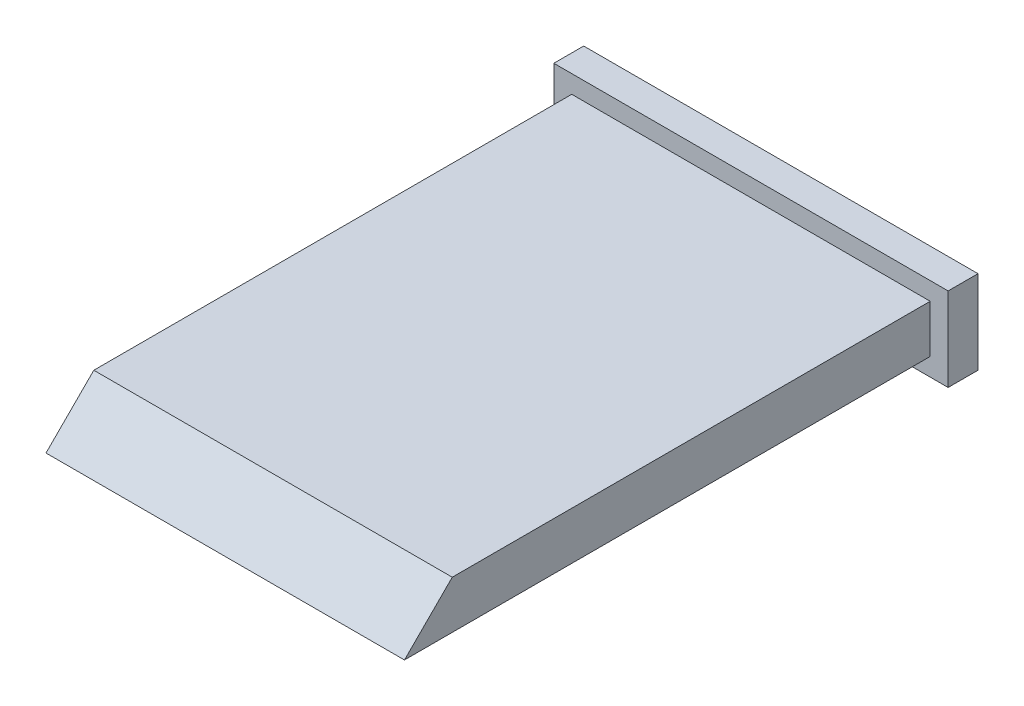
ISO-10303-21;
HEADER;
FILE_DESCRIPTION(('STEP AP214'),'2;1');
FILE_NAME('part.step','',(''),(''),'','','');
FILE_SCHEMA(('AUTOMOTIVE_DESIGN { 1 0 10303 214 1 1 1 1 }'));
ENDSEC;
DATA;
#1=APPLICATION_CONTEXT('core data for automotive mechanical design processes');
#2=APPLICATION_PROTOCOL_DEFINITION('international standard','automotive_design',2000,#1);
#3=PRODUCT_CONTEXT('',#1,'mechanical');
#4=PRODUCT('Part','Part','',(#3));
#5=PRODUCT_RELATED_PRODUCT_CATEGORY('part','',(#4));
#6=PRODUCT_DEFINITION_FORMATION('','',#4);
#7=PRODUCT_DEFINITION_CONTEXT('part definition',#1,'design');
#8=PRODUCT_DEFINITION('design','',#6,#7);
#9=PRODUCT_DEFINITION_SHAPE('','',#8);
#10=(LENGTH_UNIT() NAMED_UNIT(*) SI_UNIT(.MILLI.,.METRE.));
#11=(NAMED_UNIT(*) PLANE_ANGLE_UNIT() SI_UNIT($,.RADIAN.));
#12=(NAMED_UNIT(*) SI_UNIT($,.STERADIAN.) SOLID_ANGLE_UNIT());
#13=UNCERTAINTY_MEASURE_WITH_UNIT(LENGTH_MEASURE(1.E-05),#10,'distance_accuracy_value','');
#14=(GEOMETRIC_REPRESENTATION_CONTEXT(3) GLOBAL_UNCERTAINTY_ASSIGNED_CONTEXT((#13)) GLOBAL_UNIT_ASSIGNED_CONTEXT((#10,
#11,#12)) REPRESENTATION_CONTEXT('',''));
#15=CARTESIAN_POINT('',(0.,0.,0.));
#16=DIRECTION('',(0.,0.,1.));
#17=DIRECTION('',(1.,0.,0.));
#18=AXIS2_PLACEMENT_3D('',#15,#16,#17);
#19=CARTESIAN_POINT('',(60.,0.,-88.0000000000001));
#20=DIRECTION('',(0.,1.,0.));
#21=DIRECTION('',(0.,0.,1.));
#22=AXIS2_PLACEMENT_3D('',#19,#20,#21);
#23=PLANE('',#22);
#24=DIRECTION('',(0.,0.,-1.));
#25=VECTOR('',#24,1.);
#26=CARTESIAN_POINT('',(0.,0.,-88.0000000000001));
#27=LINE('',#26,#25);
#28=CARTESIAN_POINT('',(0.,0.,0.));
#29=VERTEX_POINT('',#28);
#30=CARTESIAN_POINT('',(0.,0.,-88.0000000000001));
#31=VERTEX_POINT('',#30);
#32=EDGE_CURVE('E130',#29,#31,#27,.T.);
#33=ORIENTED_EDGE('',*,*,#32,.T.);
#34=DIRECTION('',(-1.,0.,0.));
#35=VECTOR('',#34,1.);
#36=CARTESIAN_POINT('',(60.,0.,-88.0000000000001));
#37=LINE('',#36,#35);
#38=CARTESIAN_POINT('',(60.,0.,-88.0000000000001));
#39=VERTEX_POINT('',#38);
#40=EDGE_CURVE('E11',#39,#31,#37,.T.);
#41=ORIENTED_EDGE('',*,*,#40,.F.);
#42=DIRECTION('',(0.,0.,-1.));
#43=VECTOR('',#42,1.);
#44=CARTESIAN_POINT('',(60.,0.,-88.0000000000001));
#45=LINE('',#44,#43);
#46=CARTESIAN_POINT('',(60.,0.,0.));
#47=VERTEX_POINT('',#46);
#48=EDGE_CURVE('E75',#47,#39,#45,.T.);
#49=ORIENTED_EDGE('',*,*,#48,.F.);
#50=DIRECTION('',(-1.,0.,0.));
#51=VECTOR('',#50,1.);
#52=CARTESIAN_POINT('',(60.,0.,0.));
#53=LINE('',#52,#51);
#54=EDGE_CURVE('E144',#47,#29,#53,.T.);
#55=ORIENTED_EDGE('',*,*,#54,.T.);
#56=EDGE_LOOP('',(#33,#41,#49,#55));
#57=FACE_BOUND('',#56,.T.);
#58=ADVANCED_FACE('F33',(#57),#23,.F.);
#59=CARTESIAN_POINT('',(60.,7.99999999999999,-8.00000000000007));
#60=DIRECTION('',(0.,-1.,0.));
#61=DIRECTION('',(0.,0.,-1.));
#62=AXIS2_PLACEMENT_3D('',#59,#60,#61);
#63=PLANE('',#62);
#64=DIRECTION('',(0.,0.,1.));
#65=VECTOR('',#64,1.);
#66=CARTESIAN_POINT('',(0.,7.99999999999999,-8.00000000000007));
#67=LINE('',#66,#65);
#68=CARTESIAN_POINT('',(0.,7.99999999999999,-88.0000000000001));
#69=VERTEX_POINT('',#68);
#70=CARTESIAN_POINT('',(0.,7.99999999999999,-8.00000000000007));
#71=VERTEX_POINT('',#70);
#72=EDGE_CURVE('E64',#69,#71,#67,.T.);
#73=ORIENTED_EDGE('',*,*,#72,.T.);
#74=DIRECTION('',(-1.,0.,0.));
#75=VECTOR('',#74,1.);
#76=CARTESIAN_POINT('',(60.,7.99999999999999,-8.00000000000007));
#77=LINE('',#76,#75);
#78=CARTESIAN_POINT('',(60.,7.99999999999999,-8.00000000000007));
#79=VERTEX_POINT('',#78);
#80=EDGE_CURVE('E151',#79,#71,#77,.T.);
#81=ORIENTED_EDGE('',*,*,#80,.F.);
#82=DIRECTION('',(0.,0.,1.));
#83=VECTOR('',#82,1.);
#84=CARTESIAN_POINT('',(60.,7.99999999999999,-8.00000000000007));
#85=LINE('',#84,#83);
#86=CARTESIAN_POINT('',(60.,7.99999999999999,-88.0000000000001));
#87=VERTEX_POINT('',#86);
#88=EDGE_CURVE('E142',#87,#79,#85,.T.);
#89=ORIENTED_EDGE('',*,*,#88,.F.);
#90=DIRECTION('',(-1.,0.,0.));
#91=VECTOR('',#90,1.);
#92=CARTESIAN_POINT('',(60.,7.99999999999999,-88.0000000000001));
#93=LINE('',#92,#91);
#94=EDGE_CURVE('E41',#87,#69,#93,.T.);
#95=ORIENTED_EDGE('',*,*,#94,.T.);
#96=EDGE_LOOP('',(#73,#81,#89,#95));
#97=FACE_BOUND('',#96,.T.);
#98=ADVANCED_FACE('F154',(#97),#63,.F.);
#99=CARTESIAN_POINT('',(60.,0.,0.));
#100=DIRECTION('',(0.,-0.707106781186551,-0.707106781186544));
#101=DIRECTION('',(0.,0.707106781186544,-0.707106781186551));
#102=AXIS2_PLACEMENT_3D('',#99,#100,#101);
#103=PLANE('',#102);
#104=DIRECTION('',(0.,-0.707106781186544,0.707106781186551));
#105=VECTOR('',#104,1.);
#106=CARTESIAN_POINT('',(0.,0.,0.));
#107=LINE('',#106,#105);
#108=EDGE_CURVE('E70',#71,#29,#107,.T.);
#109=ORIENTED_EDGE('',*,*,#108,.T.);
#110=ORIENTED_EDGE('',*,*,#54,.F.);
#111=DIRECTION('',(0.,-0.707106781186544,0.707106781186551));
#112=VECTOR('',#111,1.);
#113=CARTESIAN_POINT('',(60.,0.,0.));
#114=LINE('',#113,#112);
#115=EDGE_CURVE('E49',#79,#47,#114,.T.);
#116=ORIENTED_EDGE('',*,*,#115,.F.);
#117=ORIENTED_EDGE('',*,*,#80,.T.);
#118=EDGE_LOOP('',(#109,#110,#116,#117));
#119=FACE_BOUND('',#118,.T.);
#120=ADVANCED_FACE('F163',(#119),#103,.F.);
#121=CARTESIAN_POINT('',(60.,0.,0.));
#122=DIRECTION('',(1.,0.,0.));
#123=DIRECTION('',(0.,0.,-1.));
#124=AXIS2_PLACEMENT_3D('',#121,#122,#123);
#125=PLANE('',#124);
#126=ORIENTED_EDGE('',*,*,#48,.T.);
#127=DIRECTION('',(0.,1.,0.));
#128=VECTOR('',#127,1.);
#129=CARTESIAN_POINT('',(60.,7.99999999999999,-88.0000000000001));
#130=LINE('',#129,#128);
#131=EDGE_CURVE('E140',#39,#87,#130,.T.);
#132=ORIENTED_EDGE('',*,*,#131,.T.);
#133=ORIENTED_EDGE('',*,*,#88,.T.);
#134=ORIENTED_EDGE('',*,*,#115,.T.);
#135=EDGE_LOOP('',(#126,#132,#133,#134));
#136=FACE_BOUND('',#135,.T.);
#137=ADVANCED_FACE('F165',(#136),#125,.T.);
#138=CARTESIAN_POINT('',(0.,0.,0.));
#139=DIRECTION('',(1.,0.,0.));
#140=DIRECTION('',(0.,0.,-1.));
#141=AXIS2_PLACEMENT_3D('',#138,#139,#140);
#142=PLANE('',#141);
#143=ORIENTED_EDGE('',*,*,#32,.F.);
#144=ORIENTED_EDGE('',*,*,#108,.F.);
#145=ORIENTED_EDGE('',*,*,#72,.F.);
#146=DIRECTION('',(0.,1.,0.));
#147=VECTOR('',#146,1.);
#148=CARTESIAN_POINT('',(0.,7.99999999999999,-88.0000000000001));
#149=LINE('',#148,#147);
#150=EDGE_CURVE('E133',#31,#69,#149,.T.);
#151=ORIENTED_EDGE('',*,*,#150,.F.);
#152=EDGE_LOOP('',(#143,#144,#145,#151));
#153=FACE_BOUND('',#152,.T.);
#154=ADVANCED_FACE('F161',(#153),#142,.F.);
#155=CARTESIAN_POINT('',(63.,-2.99999999999999,-93.0000000000001));
#156=DIRECTION('',(0.,1.,0.));
#157=DIRECTION('',(0.,0.,1.));
#158=AXIS2_PLACEMENT_3D('',#155,#156,#157);
#159=PLANE('',#158);
#160=DIRECTION('',(-1.,0.,0.));
#161=VECTOR('',#160,1.);
#162=CARTESIAN_POINT('',(63.,-2.99999999999999,-88.0000000000001));
#163=LINE('',#162,#161);
#164=CARTESIAN_POINT('',(63.,-2.99999999999999,-88.0000000000001));
#165=VERTEX_POINT('',#164);
#166=CARTESIAN_POINT('',(-3.,-2.99999999999999,-88.0000000000001));
#167=VERTEX_POINT('',#166);
#168=EDGE_CURVE('E129',#165,#167,#163,.T.);
#169=ORIENTED_EDGE('',*,*,#168,.T.);
#170=DIRECTION('',(0.,0.,1.));
#171=VECTOR('',#170,1.);
#172=CARTESIAN_POINT('',(-3.,-2.99999999999999,-93.0000000000001));
#173=LINE('',#172,#171);
#174=CARTESIAN_POINT('',(-3.,-2.99999999999999,-93.0000000000001));
#175=VERTEX_POINT('',#174);
#176=EDGE_CURVE('E109',#175,#167,#173,.T.);
#177=ORIENTED_EDGE('',*,*,#176,.F.);
#178=DIRECTION('',(-1.,0.,0.));
#179=VECTOR('',#178,1.);
#180=CARTESIAN_POINT('',(63.,-2.99999999999999,-93.0000000000001));
#181=LINE('',#180,#179);
#182=CARTESIAN_POINT('',(63.,-2.99999999999999,-93.0000000000001));
#183=VERTEX_POINT('',#182);
#184=EDGE_CURVE('E116',#183,#175,#181,.T.);
#185=ORIENTED_EDGE('',*,*,#184,.F.);
#186=DIRECTION('',(0.,0.,1.));
#187=VECTOR('',#186,1.);
#188=CARTESIAN_POINT('',(63.,-2.99999999999999,-93.0000000000001));
#189=LINE('',#188,#187);
#190=EDGE_CURVE('E252',#183,#165,#189,.T.);
#191=ORIENTED_EDGE('',*,*,#190,.T.);
#192=EDGE_LOOP('',(#169,#177,#185,#191));
#193=FACE_BOUND('',#192,.T.);
#194=ADVANCED_FACE('F127',(#193),#159,.F.);
#195=CARTESIAN_POINT('',(-3.,-2.99999999999999,-93.0000000000001));
#196=DIRECTION('',(1.,0.,0.));
#197=DIRECTION('',(0.,0.,-1.));
#198=AXIS2_PLACEMENT_3D('',#195,#196,#197);
#199=PLANE('',#198);
#200=DIRECTION('',(0.,1.,0.));
#201=VECTOR('',#200,1.);
#202=CARTESIAN_POINT('',(-3.,-2.99999999999999,-88.0000000000001));
#203=LINE('',#202,#201);
#204=CARTESIAN_POINT('',(-3.,11.,-88.0000000000001));
#205=VERTEX_POINT('',#204);
#206=EDGE_CURVE('E258',#167,#205,#203,.T.);
#207=ORIENTED_EDGE('',*,*,#206,.T.);
#208=DIRECTION('',(0.,0.,1.));
#209=VECTOR('',#208,1.);
#210=CARTESIAN_POINT('',(-3.,11.,-93.0000000000001));
#211=LINE('',#210,#209);
#212=CARTESIAN_POINT('',(-3.,11.,-93.0000000000001));
#213=VERTEX_POINT('',#212);
#214=EDGE_CURVE('E112',#213,#205,#211,.T.);
#215=ORIENTED_EDGE('',*,*,#214,.F.);
#216=DIRECTION('',(0.,1.,0.));
#217=VECTOR('',#216,1.);
#218=CARTESIAN_POINT('',(-3.,-2.99999999999999,-93.0000000000001));
#219=LINE('',#218,#217);
#220=EDGE_CURVE('E105',#175,#213,#219,.T.);
#221=ORIENTED_EDGE('',*,*,#220,.F.);
#222=ORIENTED_EDGE('',*,*,#176,.T.);
#223=EDGE_LOOP('',(#207,#215,#221,#222));
#224=FACE_BOUND('',#223,.T.);
#225=ADVANCED_FACE('F107',(#224),#199,.F.);
#226=CARTESIAN_POINT('',(-3.,11.,-93.0000000000001));
#227=DIRECTION('',(0.,-1.,0.));
#228=DIRECTION('',(0.,0.,-1.));
#229=AXIS2_PLACEMENT_3D('',#226,#227,#228);
#230=PLANE('',#229);
#231=DIRECTION('',(1.,0.,0.));
#232=VECTOR('',#231,1.);
#233=CARTESIAN_POINT('',(-3.,11.,-88.0000000000001));
#234=LINE('',#233,#232);
#235=CARTESIAN_POINT('',(63.,11.,-88.0000000000001));
#236=VERTEX_POINT('',#235);
#237=EDGE_CURVE('E255',#205,#236,#234,.T.);
#238=ORIENTED_EDGE('',*,*,#237,.T.);
#239=DIRECTION('',(0.,0.,1.));
#240=VECTOR('',#239,1.);
#241=CARTESIAN_POINT('',(63.,11.,-93.0000000000001));
#242=LINE('',#241,#240);
#243=CARTESIAN_POINT('',(63.,11.,-93.0000000000001));
#244=VERTEX_POINT('',#243);
#245=EDGE_CURVE('E135',#244,#236,#242,.T.);
#246=ORIENTED_EDGE('',*,*,#245,.F.);
#247=DIRECTION('',(1.,0.,0.));
#248=VECTOR('',#247,1.);
#249=CARTESIAN_POINT('',(-3.,11.,-93.0000000000001));
#250=LINE('',#249,#248);
#251=EDGE_CURVE('E115',#213,#244,#250,.T.);
#252=ORIENTED_EDGE('',*,*,#251,.F.);
#253=ORIENTED_EDGE('',*,*,#214,.T.);
#254=EDGE_LOOP('',(#238,#246,#252,#253));
#255=FACE_BOUND('',#254,.T.);
#256=ADVANCED_FACE('F211',(#255),#230,.F.);
#257=CARTESIAN_POINT('',(63.,11.,-93.0000000000001));
#258=DIRECTION('',(-1.,0.,0.));
#259=DIRECTION('',(0.,0.,1.));
#260=AXIS2_PLACEMENT_3D('',#257,#258,#259);
#261=PLANE('',#260);
#262=DIRECTION('',(0.,-1.,0.));
#263=VECTOR('',#262,1.);
#264=CARTESIAN_POINT('',(63.,11.,-88.0000000000001));
#265=LINE('',#264,#263);
#266=EDGE_CURVE('E125',#236,#165,#265,.T.);
#267=ORIENTED_EDGE('',*,*,#266,.T.);
#268=ORIENTED_EDGE('',*,*,#190,.F.);
#269=DIRECTION('',(0.,-1.,0.));
#270=VECTOR('',#269,1.);
#271=CARTESIAN_POINT('',(63.,11.,-93.0000000000001));
#272=LINE('',#271,#270);
#273=EDGE_CURVE('E121',#244,#183,#272,.T.);
#274=ORIENTED_EDGE('',*,*,#273,.F.);
#275=ORIENTED_EDGE('',*,*,#245,.T.);
#276=EDGE_LOOP('',(#267,#268,#274,#275));
#277=FACE_BOUND('',#276,.T.);
#278=ADVANCED_FACE('F220',(#277),#261,.F.);
#279=CARTESIAN_POINT('',(0.,0.,-93.0000000000001));
#280=DIRECTION('',(0.,0.,-1.));
#281=DIRECTION('',(-1.,0.,0.));
#282=AXIS2_PLACEMENT_3D('',#279,#280,#281);
#283=PLANE('',#282);
#284=ORIENTED_EDGE('',*,*,#184,.T.);
#285=ORIENTED_EDGE('',*,*,#220,.T.);
#286=ORIENTED_EDGE('',*,*,#251,.T.);
#287=ORIENTED_EDGE('',*,*,#273,.T.);
#288=EDGE_LOOP('',(#284,#285,#286,#287));
#289=FACE_BOUND('',#288,.T.);
#290=ADVANCED_FACE('F119',(#289),#283,.T.);
#291=CARTESIAN_POINT('',(0.,0.,-88.0000000000001));
#292=DIRECTION('',(0.,0.,-1.));
#293=DIRECTION('',(-1.,0.,0.));
#294=AXIS2_PLACEMENT_3D('',#291,#292,#293);
#295=PLANE('',#294);
#296=ORIENTED_EDGE('',*,*,#131,.F.);
#297=ORIENTED_EDGE('',*,*,#40,.T.);
#298=ORIENTED_EDGE('',*,*,#150,.T.);
#299=ORIENTED_EDGE('',*,*,#94,.F.);
#300=EDGE_LOOP('',(#296,#297,#298,#299));
#301=FACE_BOUND('',#300,.T.);
#302=ORIENTED_EDGE('',*,*,#168,.F.);
#303=ORIENTED_EDGE('',*,*,#266,.F.);
#304=ORIENTED_EDGE('',*,*,#237,.F.);
#305=ORIENTED_EDGE('',*,*,#206,.F.);
#306=EDGE_LOOP('',(#302,#303,#304,#305));
#307=FACE_BOUND('',#306,.T.);
#308=ADVANCED_FACE('F157',(#301,#307),#295,.F.);
#309=CLOSED_SHELL('',(#58,#98,#120,#137,#154,#194,#225,#256,#278,#290,#308));
#310=MANIFOLD_SOLID_BREP('B2',#309);
#311=ADVANCED_BREP_SHAPE_REPRESENTATION('',(#18,#310),#14);
#312=SHAPE_DEFINITION_REPRESENTATION(#9,#311);
ENDSEC;
END-ISO-10303-21;
